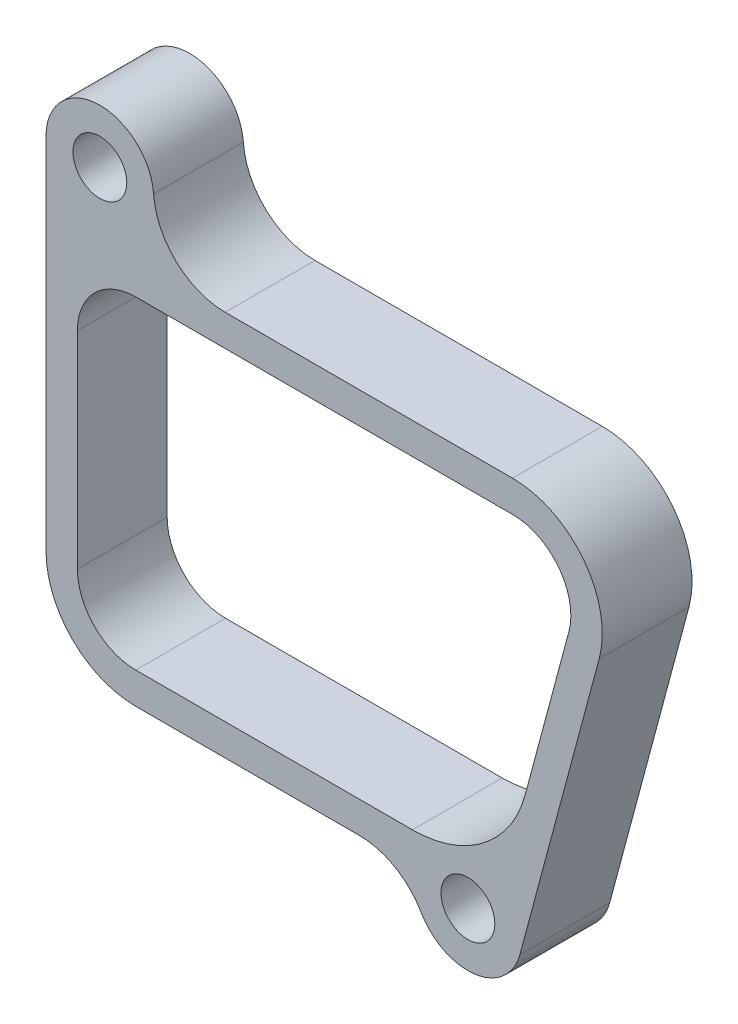
ISO-10303-21;
HEADER;
FILE_DESCRIPTION(('STEP AP214'),'2;1');
FILE_NAME('part.step','',(''),(''),'','','');
FILE_SCHEMA(('AUTOMOTIVE_DESIGN { 1 0 10303 214 1 1 1 1 }'));
ENDSEC;
DATA;
#1=APPLICATION_CONTEXT('core data for automotive mechanical design processes');
#2=APPLICATION_PROTOCOL_DEFINITION('international standard','automotive_design',2000,#1);
#3=PRODUCT_CONTEXT('',#1,'mechanical');
#4=PRODUCT('Part','Part','',(#3));
#5=PRODUCT_RELATED_PRODUCT_CATEGORY('part','',(#4));
#6=PRODUCT_DEFINITION_FORMATION('','',#4);
#7=PRODUCT_DEFINITION_CONTEXT('part definition',#1,'design');
#8=PRODUCT_DEFINITION('design','',#6,#7);
#9=PRODUCT_DEFINITION_SHAPE('','',#8);
#10=(LENGTH_UNIT() NAMED_UNIT(*) SI_UNIT(.MILLI.,.METRE.));
#11=(NAMED_UNIT(*) PLANE_ANGLE_UNIT() SI_UNIT($,.RADIAN.));
#12=(NAMED_UNIT(*) SI_UNIT($,.STERADIAN.) SOLID_ANGLE_UNIT());
#13=UNCERTAINTY_MEASURE_WITH_UNIT(LENGTH_MEASURE(1.E-05),#10,'distance_accuracy_value','');
#14=(GEOMETRIC_REPRESENTATION_CONTEXT(3) GLOBAL_UNCERTAINTY_ASSIGNED_CONTEXT((#13)) GLOBAL_UNIT_ASSIGNED_CONTEXT((#10,
#11,#12)) REPRESENTATION_CONTEXT('',''));
#15=CARTESIAN_POINT('',(0.,0.,0.));
#16=DIRECTION('',(0.,0.,1.));
#17=DIRECTION('',(1.,0.,0.));
#18=AXIS2_PLACEMENT_3D('',#15,#16,#17);
#19=CARTESIAN_POINT('',(113.598151470631,-30.4385329482234,10.));
#20=DIRECTION('',(-0.965925826289069,0.258819045102518,0.));
#21=DIRECTION('',(-0.258819045102518,-0.965925826289069,0.));
#22=AXIS2_PLACEMENT_3D('',#19,#20,#21);
#23=PLANE('',#22);
#24=DIRECTION('',(0.258819045102518,0.965925826289069,0.));
#25=VECTOR('',#24,1.);
#26=CARTESIAN_POINT('',(113.598151470631,-30.4385329482234,-10.));
#27=LINE('',#26,#25);
#28=CARTESIAN_POINT('',(93.5911099154689,-105.10582854123,-10.));
#29=VERTEX_POINT('',#28);
#30=CARTESIAN_POINT('',(111.256852167817,-39.1763809020504,-10.));
#31=VERTEX_POINT('',#30);
#32=EDGE_CURVE('E247',#29,#31,#27,.T.);
#33=ORIENTED_EDGE('',*,*,#32,.T.);
#34=DIRECTION('',(0.,0.,-1.));
#35=VECTOR('',#34,1.);
#36=CARTESIAN_POINT('',(111.256852167817,-39.1763809020504,10.));
#37=LINE('',#36,#35);
#38=CARTESIAN_POINT('',(111.256852167817,-39.1763809020504,10.));
#39=VERTEX_POINT('',#38);
#40=EDGE_CURVE('E11',#39,#31,#37,.T.);
#41=ORIENTED_EDGE('',*,*,#40,.F.);
#42=DIRECTION('',(0.258819045102518,0.965925826289069,0.));
#43=VECTOR('',#42,1.);
#44=CARTESIAN_POINT('',(113.598151470631,-30.4385329482234,10.));
#45=LINE('',#44,#43);
#46=CARTESIAN_POINT('',(93.5911099154689,-105.10582854123,10.));
#47=VERTEX_POINT('',#46);
#48=EDGE_CURVE('E374',#47,#39,#45,.T.);
#49=ORIENTED_EDGE('',*,*,#48,.F.);
#50=DIRECTION('',(0.,0.,-1.));
#51=VECTOR('',#50,1.);
#52=CARTESIAN_POINT('',(93.5911099154689,-105.10582854123,10.));
#53=LINE('',#52,#51);
#54=EDGE_CURVE('E286',#47,#29,#53,.T.);
#55=ORIENTED_EDGE('',*,*,#54,.T.);
#56=EDGE_LOOP('',(#33,#41,#49,#55));
#57=FACE_BOUND('',#56,.T.);
#58=ADVANCED_FACE('F43',(#57),#23,.F.);
#59=CARTESIAN_POINT('',(91.9383356420355,-34.,10.));
#60=DIRECTION('',(0.,0.,-1.));
#61=DIRECTION('',(-1.,0.,0.));
#62=AXIS2_PLACEMENT_3D('',#59,#60,#61);
#63=CYLINDRICAL_SURFACE('',#62,20.);
#64=CARTESIAN_POINT('',(91.9383356420355,-34.,-10.));
#65=DIRECTION('',(0.,0.,1.));
#66=DIRECTION('',(1.,0.,0.));
#67=AXIS2_PLACEMENT_3D('',#64,#65,#66);
#68=CIRCLE('',#67,20.);
#69=CARTESIAN_POINT('',(91.9383356420355,-14.,-10.));
#70=VERTEX_POINT('',#69);
#71=EDGE_CURVE('E251',#31,#70,#68,.T.);
#72=ORIENTED_EDGE('',*,*,#71,.T.);
#73=DIRECTION('',(0.,0.,-1.));
#74=VECTOR('',#73,1.);
#75=CARTESIAN_POINT('',(91.9383356420355,-14.,10.));
#76=LINE('',#75,#74);
#77=CARTESIAN_POINT('',(91.9383356420355,-14.,10.));
#78=VERTEX_POINT('',#77);
#79=EDGE_CURVE('E54',#78,#70,#76,.T.);
#80=ORIENTED_EDGE('',*,*,#79,.F.);
#81=CARTESIAN_POINT('',(91.9383356420355,-34.,10.));
#82=DIRECTION('',(0.,0.,1.));
#83=DIRECTION('',(1.,0.,0.));
#84=AXIS2_PLACEMENT_3D('',#81,#82,#83);
#85=CIRCLE('',#84,20.);
#86=EDGE_CURVE('E377',#39,#78,#85,.T.);
#87=ORIENTED_EDGE('',*,*,#86,.F.);
#88=ORIENTED_EDGE('',*,*,#40,.T.);
#89=EDGE_LOOP('',(#72,#80,#87,#88));
#90=FACE_BOUND('',#89,.T.);
#91=ADVANCED_FACE('F421',(#90),#63,.T.);
#92=CARTESIAN_POINT('',(0.,-14.,10.));
#93=DIRECTION('',(0.,1.,0.));
#94=DIRECTION('',(0.,0.,1.));
#95=AXIS2_PLACEMENT_3D('',#92,#93,#94);
#96=PLANE('',#95);
#97=DIRECTION('',(1.,0.,0.));
#98=VECTOR('',#97,1.);
#99=CARTESIAN_POINT('',(0.,-14.,-10.));
#100=LINE('',#99,#98);
#101=CARTESIAN_POINT('',(27.9284800875379,-14.,-10.));
#102=VERTEX_POINT('',#101);
#103=EDGE_CURVE('E255',#102,#70,#100,.T.);
#104=ORIENTED_EDGE('',*,*,#103,.F.);
#105=DIRECTION('',(0.,0.,-1.));
#106=VECTOR('',#105,1.);
#107=CARTESIAN_POINT('',(27.9284800875379,-14.,10.));
#108=LINE('',#107,#106);
#109=CARTESIAN_POINT('',(27.9284800875379,-14.,10.));
#110=VERTEX_POINT('',#109);
#111=EDGE_CURVE('E303',#110,#102,#108,.T.);
#112=ORIENTED_EDGE('',*,*,#111,.F.);
#113=DIRECTION('',(1.,0.,0.));
#114=VECTOR('',#113,1.);
#115=CARTESIAN_POINT('',(0.,-14.,10.));
#116=LINE('',#115,#114);
#117=EDGE_CURVE('E380',#110,#78,#116,.T.);
#118=ORIENTED_EDGE('',*,*,#117,.T.);
#119=ORIENTED_EDGE('',*,*,#79,.T.);
#120=EDGE_LOOP('',(#104,#112,#118,#119));
#121=FACE_BOUND('',#120,.T.);
#122=ADVANCED_FACE('F426',(#121),#96,.T.);
#123=CARTESIAN_POINT('',(27.9284800875379,1.99999999999999,10.));
#124=DIRECTION('',(0.,0.,-1.));
#125=DIRECTION('',(-1.,0.,0.));
#126=AXIS2_PLACEMENT_3D('',#123,#124,#125);
#127=CYLINDRICAL_SURFACE('',#126,16.);
#128=CARTESIAN_POINT('',(27.9284800875379,1.99999999999999,-10.));
#129=DIRECTION('',(0.,0.,1.));
#130=DIRECTION('',(1.,0.,0.));
#131=AXIS2_PLACEMENT_3D('',#128,#129,#130);
#132=CIRCLE('',#131,16.);
#133=CARTESIAN_POINT('',(11.9693486089448,0.857142857142852,-10.));
#134=VERTEX_POINT('',#133);
#135=EDGE_CURVE('E259',#134,#102,#132,.T.);
#136=ORIENTED_EDGE('',*,*,#135,.F.);
#137=DIRECTION('',(0.,0.,-1.));
#138=VECTOR('',#137,1.);
#139=CARTESIAN_POINT('',(11.9693486089448,0.857142857142852,10.));
#140=LINE('',#139,#138);
#141=CARTESIAN_POINT('',(11.9693486089448,0.857142857142852,10.));
#142=VERTEX_POINT('',#141);
#143=EDGE_CURVE('E300',#142,#134,#140,.T.);
#144=ORIENTED_EDGE('',*,*,#143,.F.);
#145=CARTESIAN_POINT('',(27.9284800875379,1.99999999999999,10.));
#146=DIRECTION('',(0.,0.,1.));
#147=DIRECTION('',(1.,0.,0.));
#148=AXIS2_PLACEMENT_3D('',#145,#146,#147);
#149=CIRCLE('',#148,16.);
#150=EDGE_CURVE('E384',#142,#110,#149,.T.);
#151=ORIENTED_EDGE('',*,*,#150,.T.);
#152=ORIENTED_EDGE('',*,*,#111,.T.);
#153=EDGE_LOOP('',(#136,#144,#151,#152));
#154=FACE_BOUND('',#153,.T.);
#155=ADVANCED_FACE('F461',(#154),#127,.F.);
#156=CARTESIAN_POINT('',(0.,0.,10.));
#157=DIRECTION('',(0.,0.,-1.));
#158=DIRECTION('',(-1.,0.,0.));
#159=AXIS2_PLACEMENT_3D('',#156,#157,#158);
#160=CYLINDRICAL_SURFACE('',#159,12.);
#161=CARTESIAN_POINT('',(0.,0.,-10.));
#162=DIRECTION('',(0.,0.,1.));
#163=DIRECTION('',(1.,0.,0.));
#164=AXIS2_PLACEMENT_3D('',#161,#162,#163);
#165=CIRCLE('',#164,12.);
#166=CARTESIAN_POINT('',(-12.,0.,-10.));
#167=VERTEX_POINT('',#166);
#168=EDGE_CURVE('E263',#134,#167,#165,.T.);
#169=ORIENTED_EDGE('',*,*,#168,.T.);
#170=DIRECTION('',(0.,0.,-1.));
#171=VECTOR('',#170,1.);
#172=CARTESIAN_POINT('',(-12.,0.,10.));
#173=LINE('',#172,#171);
#174=CARTESIAN_POINT('',(-12.,0.,10.));
#175=VERTEX_POINT('',#174);
#176=EDGE_CURVE('E296',#175,#167,#173,.T.);
#177=ORIENTED_EDGE('',*,*,#176,.F.);
#178=CARTESIAN_POINT('',(0.,0.,10.));
#179=DIRECTION('',(0.,0.,1.));
#180=DIRECTION('',(1.,0.,0.));
#181=AXIS2_PLACEMENT_3D('',#178,#179,#180);
#182=CIRCLE('',#181,12.);
#183=EDGE_CURVE('E388',#142,#175,#182,.T.);
#184=ORIENTED_EDGE('',*,*,#183,.F.);
#185=ORIENTED_EDGE('',*,*,#143,.T.);
#186=EDGE_LOOP('',(#169,#177,#184,#185));
#187=FACE_BOUND('',#186,.T.);
#188=ADVANCED_FACE('F457',(#187),#160,.T.);
#189=CARTESIAN_POINT('',(-12.,0.,10.));
#190=DIRECTION('',(1.,0.,0.));
#191=DIRECTION('',(0.,1.,0.));
#192=AXIS2_PLACEMENT_3D('',#189,#190,#191);
#193=PLANE('',#192);
#194=DIRECTION('',(0.,-1.,0.));
#195=VECTOR('',#194,1.);
#196=CARTESIAN_POINT('',(-12.,0.,-10.));
#197=LINE('',#196,#195);
#198=CARTESIAN_POINT('',(-12.,-79.9999999999999,-10.));
#199=VERTEX_POINT('',#198);
#200=EDGE_CURVE('E266',#167,#199,#197,.T.);
#201=ORIENTED_EDGE('',*,*,#200,.T.);
#202=DIRECTION('',(0.,0.,-1.));
#203=VECTOR('',#202,1.);
#204=CARTESIAN_POINT('',(-12.,-79.9999999999999,10.));
#205=LINE('',#204,#203);
#206=CARTESIAN_POINT('',(-12.,-79.9999999999999,10.));
#207=VERTEX_POINT('',#206);
#208=EDGE_CURVE('E293',#207,#199,#205,.T.);
#209=ORIENTED_EDGE('',*,*,#208,.F.);
#210=DIRECTION('',(0.,-1.,0.));
#211=VECTOR('',#210,1.);
#212=CARTESIAN_POINT('',(-12.,0.,10.));
#213=LINE('',#212,#211);
#214=EDGE_CURVE('E391',#175,#207,#213,.T.);
#215=ORIENTED_EDGE('',*,*,#214,.F.);
#216=ORIENTED_EDGE('',*,*,#176,.T.);
#217=EDGE_LOOP('',(#201,#209,#215,#216));
#218=FACE_BOUND('',#217,.T.);
#219=ADVANCED_FACE('F454',(#218),#193,.F.);
#220=CARTESIAN_POINT('',(8.00000000000001,-80.,10.));
#221=DIRECTION('',(0.,0.,-1.));
#222=DIRECTION('',(-1.,0.,0.));
#223=AXIS2_PLACEMENT_3D('',#220,#221,#222);
#224=CYLINDRICAL_SURFACE('',#223,20.);
#225=CARTESIAN_POINT('',(8.00000000000001,-80.,-10.));
#226=DIRECTION('',(0.,0.,1.));
#227=DIRECTION('',(1.,0.,0.));
#228=AXIS2_PLACEMENT_3D('',#225,#226,#227);
#229=CIRCLE('',#228,20.);
#230=CARTESIAN_POINT('',(8.00000000000015,-100.,-10.));
#231=VERTEX_POINT('',#230);
#232=EDGE_CURVE('E270',#231,#199,#229,.F.);
#233=ORIENTED_EDGE('',*,*,#232,.F.);
#234=DIRECTION('',(0.,0.,-1.));
#235=VECTOR('',#234,1.);
#236=CARTESIAN_POINT('',(8.00000000000015,-100.,10.));
#237=LINE('',#236,#235);
#238=CARTESIAN_POINT('',(8.00000000000015,-100.,10.));
#239=VERTEX_POINT('',#238);
#240=EDGE_CURVE('E197',#239,#231,#237,.T.);
#241=ORIENTED_EDGE('',*,*,#240,.F.);
#242=CARTESIAN_POINT('',(8.00000000000001,-80.,10.));
#243=DIRECTION('',(0.,0.,1.));
#244=DIRECTION('',(1.,0.,0.));
#245=AXIS2_PLACEMENT_3D('',#242,#243,#244);
#246=CIRCLE('',#245,20.);
#247=EDGE_CURVE('E184',#239,#207,#246,.F.);
#248=ORIENTED_EDGE('',*,*,#247,.T.);
#249=ORIENTED_EDGE('',*,*,#208,.T.);
#250=EDGE_LOOP('',(#233,#241,#248,#249));
#251=FACE_BOUND('',#250,.T.);
#252=ADVANCED_FACE('F396',(#251),#224,.T.);
#253=CARTESIAN_POINT('',(0.,-100.,10.));
#254=DIRECTION('',(0.,1.,0.));
#255=DIRECTION('',(-1.,0.,0.));
#256=AXIS2_PLACEMENT_3D('',#253,#254,#255);
#257=PLANE('',#256);
#258=DIRECTION('',(1.,0.,0.));
#259=VECTOR('',#258,1.);
#260=CARTESIAN_POINT('',(0.,-100.,-10.));
#261=LINE('',#260,#259);
#262=CARTESIAN_POINT('',(57.7512886940357,-100.,-10.));
#263=VERTEX_POINT('',#262);
#264=EDGE_CURVE('E192',#231,#263,#261,.T.);
#265=ORIENTED_EDGE('',*,*,#264,.T.);
#266=DIRECTION('',(0.,0.,-1.));
#267=VECTOR('',#266,1.);
#268=CARTESIAN_POINT('',(57.7512886940357,-100.,10.));
#269=LINE('',#268,#267);
#270=CARTESIAN_POINT('',(57.7512886940357,-100.,10.));
#271=VERTEX_POINT('',#270);
#272=EDGE_CURVE('E189',#271,#263,#269,.T.);
#273=ORIENTED_EDGE('',*,*,#272,.F.);
#274=DIRECTION('',(1.,0.,0.));
#275=VECTOR('',#274,1.);
#276=CARTESIAN_POINT('',(0.,-100.,10.));
#277=LINE('',#276,#275);
#278=EDGE_CURVE('E177',#239,#271,#277,.T.);
#279=ORIENTED_EDGE('',*,*,#278,.F.);
#280=ORIENTED_EDGE('',*,*,#240,.T.);
#281=EDGE_LOOP('',(#265,#273,#279,#280));
#282=FACE_BOUND('',#281,.T.);
#283=ADVANCED_FACE('F190',(#282),#257,.F.);
#284=CARTESIAN_POINT('',(57.7512886940357,-116.,10.));
#285=DIRECTION('',(0.,0.,-1.));
#286=DIRECTION('',(-1.,0.,0.));
#287=AXIS2_PLACEMENT_3D('',#284,#285,#286);
#288=CYLINDRICAL_SURFACE('',#287,16.);
#289=CARTESIAN_POINT('',(57.7512886940357,-116.,-10.));
#290=DIRECTION('',(0.,0.,1.));
#291=DIRECTION('',(1.,0.,0.));
#292=AXIS2_PLACEMENT_3D('',#289,#290,#291);
#293=CIRCLE('',#292,16.);
#294=CARTESIAN_POINT('',(71.6076951545868,-108.,-10.));
#295=VERTEX_POINT('',#294);
#296=EDGE_CURVE('E276',#295,#263,#293,.T.);
#297=ORIENTED_EDGE('',*,*,#296,.F.);
#298=DIRECTION('',(0.,0.,-1.));
#299=VECTOR('',#298,1.);
#300=CARTESIAN_POINT('',(71.6076951545868,-108.,10.));
#301=LINE('',#300,#299);
#302=CARTESIAN_POINT('',(71.6076951545868,-108.,10.));
#303=VERTEX_POINT('',#302);
#304=EDGE_CURVE('E121',#303,#295,#301,.T.);
#305=ORIENTED_EDGE('',*,*,#304,.F.);
#306=CARTESIAN_POINT('',(57.7512886940357,-116.,10.));
#307=DIRECTION('',(0.,0.,1.));
#308=DIRECTION('',(1.,0.,0.));
#309=AXIS2_PLACEMENT_3D('',#306,#307,#308);
#310=CIRCLE('',#309,16.);
#311=EDGE_CURVE('E182',#303,#271,#310,.T.);
#312=ORIENTED_EDGE('',*,*,#311,.T.);
#313=ORIENTED_EDGE('',*,*,#272,.T.);
#314=EDGE_LOOP('',(#297,#305,#312,#313));
#315=FACE_BOUND('',#314,.T.);
#316=ADVANCED_FACE('F199',(#315),#288,.F.);
#317=CARTESIAN_POINT('',(91.9383356420355,-34.,10.));
#318=DIRECTION('',(0.,0.,-1.));
#319=DIRECTION('',(-1.,0.,0.));
#320=AXIS2_PLACEMENT_3D('',#317,#318,#319);
#321=CYLINDRICAL_SURFACE('',#320,13.);
#322=CARTESIAN_POINT('',(91.9383356420355,-34.,-10.));
#323=DIRECTION('',(0.,0.,1.));
#324=DIRECTION('',(1.,0.,0.));
#325=AXIS2_PLACEMENT_3D('',#322,#323,#324);
#326=CIRCLE('',#325,13.);
#327=CARTESIAN_POINT('',(104.495371383793,-37.3646475863327,-10.));
#328=VERTEX_POINT('',#327);
#329=CARTESIAN_POINT('',(91.9383356420355,-21.,-10.));
#330=VERTEX_POINT('',#329);
#331=EDGE_CURVE('E215',#328,#330,#326,.T.);
#332=ORIENTED_EDGE('',*,*,#331,.F.);
#333=DIRECTION('',(0.,0.,-1.));
#334=VECTOR('',#333,1.);
#335=CARTESIAN_POINT('',(104.495371383793,-37.3646475863327,10.));
#336=LINE('',#335,#334);
#337=CARTESIAN_POINT('',(104.495371383793,-37.3646475863327,10.));
#338=VERTEX_POINT('',#337);
#339=EDGE_CURVE('E47',#338,#328,#336,.T.);
#340=ORIENTED_EDGE('',*,*,#339,.F.);
#341=CARTESIAN_POINT('',(91.9383356420355,-34.,10.));
#342=DIRECTION('',(0.,0.,1.));
#343=DIRECTION('',(1.,0.,0.));
#344=AXIS2_PLACEMENT_3D('',#341,#342,#343);
#345=CIRCLE('',#344,13.);
#346=CARTESIAN_POINT('',(91.9383356420355,-21.,10.));
#347=VERTEX_POINT('',#346);
#348=EDGE_CURVE('E666',#338,#347,#345,.T.);
#349=ORIENTED_EDGE('',*,*,#348,.T.);
#350=DIRECTION('',(0.,0.,-1.));
#351=VECTOR('',#350,1.);
#352=CARTESIAN_POINT('',(91.9383356420355,-21.,10.));
#353=LINE('',#352,#351);
#354=EDGE_CURVE('E210',#347,#330,#353,.T.);
#355=ORIENTED_EDGE('',*,*,#354,.T.);
#356=EDGE_LOOP('',(#332,#340,#349,#355));
#357=FACE_BOUND('',#356,.T.);
#358=ADVANCED_FACE('F337',(#357),#321,.F.);
#359=CARTESIAN_POINT('',(106.836670686607,-28.6267996325058,10.));
#360=DIRECTION('',(-0.965925826289069,0.258819045102517,0.));
#361=DIRECTION('',(-0.258819045102517,-0.965925826289069,0.));
#362=AXIS2_PLACEMENT_3D('',#359,#360,#361);
#363=PLANE('',#362);
#364=DIRECTION('',(0.258819045102517,0.965925826289069,0.));
#365=VECTOR('',#364,1.);
#366=CARTESIAN_POINT('',(106.836670686607,-28.6267996325058,-10.));
#367=LINE('',#366,#365);
#368=CARTESIAN_POINT('',(94.7514934299933,-73.7292951726655,-10.));
#369=VERTEX_POINT('',#368);
#370=EDGE_CURVE('E219',#369,#328,#367,.T.);
#371=ORIENTED_EDGE('',*,*,#370,.F.);
#372=DIRECTION('',(0.,0.,-1.));
#373=VECTOR('',#372,1.);
#374=CARTESIAN_POINT('',(94.7514934299933,-73.7292951726655,10.));
#375=LINE('',#374,#373);
#376=CARTESIAN_POINT('',(94.7514934299933,-73.7292951726655,10.));
#377=VERTEX_POINT('',#376);
#378=EDGE_CURVE('E325',#377,#369,#375,.T.);
#379=ORIENTED_EDGE('',*,*,#378,.F.);
#380=DIRECTION('',(0.258819045102517,0.965925826289069,0.));
#381=VECTOR('',#380,1.);
#382=CARTESIAN_POINT('',(106.836670686607,-28.6267996325058,10.));
#383=LINE('',#382,#381);
#384=EDGE_CURVE('E336',#377,#338,#383,.T.);
#385=ORIENTED_EDGE('',*,*,#384,.T.);
#386=ORIENTED_EDGE('',*,*,#339,.T.);
#387=EDGE_LOOP('',(#371,#379,#385,#386));
#388=FACE_BOUND('',#387,.T.);
#389=ADVANCED_FACE('F334',(#388),#363,.T.);
#390=CARTESIAN_POINT('',(69.6374219464775,-67.,10.));
#391=DIRECTION('',(0.,0.,-1.));
#392=DIRECTION('',(-1.,0.,0.));
#393=AXIS2_PLACEMENT_3D('',#390,#391,#392);
#394=CYLINDRICAL_SURFACE('',#393,26.);
#395=CARTESIAN_POINT('',(69.6374219464775,-67.,-10.));
#396=DIRECTION('',(0.,0.,1.));
#397=DIRECTION('',(1.,0.,0.));
#398=AXIS2_PLACEMENT_3D('',#395,#396,#397);
#399=CIRCLE('',#398,26.);
#400=CARTESIAN_POINT('',(69.6374219464775,-93.,-10.));
#401=VERTEX_POINT('',#400);
#402=EDGE_CURVE('E223',#401,#369,#399,.T.);
#403=ORIENTED_EDGE('',*,*,#402,.F.);
#404=DIRECTION('',(0.,0.,-1.));
#405=VECTOR('',#404,1.);
#406=CARTESIAN_POINT('',(69.6374219464775,-93.,10.));
#407=LINE('',#406,#405);
#408=CARTESIAN_POINT('',(69.6374219464775,-93.,10.));
#409=VERTEX_POINT('',#408);
#410=EDGE_CURVE('E323',#409,#401,#407,.T.);
#411=ORIENTED_EDGE('',*,*,#410,.F.);
#412=CARTESIAN_POINT('',(69.6374219464775,-67.,10.));
#413=DIRECTION('',(0.,0.,1.));
#414=DIRECTION('',(1.,0.,0.));
#415=AXIS2_PLACEMENT_3D('',#412,#413,#414);
#416=CIRCLE('',#415,26.);
#417=EDGE_CURVE('E346',#409,#377,#416,.T.);
#418=ORIENTED_EDGE('',*,*,#417,.T.);
#419=ORIENTED_EDGE('',*,*,#378,.T.);
#420=EDGE_LOOP('',(#403,#411,#418,#419));
#421=FACE_BOUND('',#420,.T.);
#422=ADVANCED_FACE('F344',(#421),#394,.F.);
#423=CARTESIAN_POINT('',(0.,-93.,10.));
#424=DIRECTION('',(0.,1.,0.));
#425=DIRECTION('',(0.,0.,1.));
#426=AXIS2_PLACEMENT_3D('',#423,#424,#425);
#427=PLANE('',#426);
#428=DIRECTION('',(1.,0.,0.));
#429=VECTOR('',#428,1.);
#430=CARTESIAN_POINT('',(0.,-93.,-10.));
#431=LINE('',#430,#429);
#432=CARTESIAN_POINT('',(8.0000000000001,-93.,-10.));
#433=VERTEX_POINT('',#432);
#434=EDGE_CURVE('E227',#433,#401,#431,.T.);
#435=ORIENTED_EDGE('',*,*,#434,.F.);
#436=DIRECTION('',(0.,0.,-1.));
#437=VECTOR('',#436,1.);
#438=CARTESIAN_POINT('',(8.0000000000001,-93.,10.));
#439=LINE('',#438,#437);
#440=CARTESIAN_POINT('',(8.0000000000001,-93.,10.));
#441=VERTEX_POINT('',#440);
#442=EDGE_CURVE('E320',#441,#433,#439,.T.);
#443=ORIENTED_EDGE('',*,*,#442,.F.);
#444=DIRECTION('',(1.,0.,0.));
#445=VECTOR('',#444,1.);
#446=CARTESIAN_POINT('',(0.,-93.,10.));
#447=LINE('',#446,#445);
#448=EDGE_CURVE('E351',#441,#409,#447,.T.);
#449=ORIENTED_EDGE('',*,*,#448,.T.);
#450=ORIENTED_EDGE('',*,*,#410,.T.);
#451=EDGE_LOOP('',(#435,#443,#449,#450));
#452=FACE_BOUND('',#451,.T.);
#453=ADVANCED_FACE('F354',(#452),#427,.T.);
#454=CARTESIAN_POINT('',(8.00000000000001,-80.,10.));
#455=DIRECTION('',(0.,0.,-1.));
#456=DIRECTION('',(-1.,0.,0.));
#457=AXIS2_PLACEMENT_3D('',#454,#455,#456);
#458=CYLINDRICAL_SURFACE('',#457,13.);
#459=CARTESIAN_POINT('',(8.00000000000001,-80.,-10.));
#460=DIRECTION('',(0.,0.,1.));
#461=DIRECTION('',(1.,0.,0.));
#462=AXIS2_PLACEMENT_3D('',#459,#460,#461);
#463=CIRCLE('',#462,13.);
#464=CARTESIAN_POINT('',(-4.99999999999999,-79.9999999999999,-10.));
#465=VERTEX_POINT('',#464);
#466=EDGE_CURVE('E231',#433,#465,#463,.F.);
#467=ORIENTED_EDGE('',*,*,#466,.T.);
#468=DIRECTION('',(0.,0.,-1.));
#469=VECTOR('',#468,1.);
#470=CARTESIAN_POINT('',(-4.99999999999999,-79.9999999999999,10.));
#471=LINE('',#470,#469);
#472=CARTESIAN_POINT('',(-4.99999999999999,-79.9999999999999,10.));
#473=VERTEX_POINT('',#472);
#474=EDGE_CURVE('E317',#473,#465,#471,.T.);
#475=ORIENTED_EDGE('',*,*,#474,.F.);
#476=CARTESIAN_POINT('',(8.00000000000001,-80.,10.));
#477=DIRECTION('',(0.,0.,1.));
#478=DIRECTION('',(1.,0.,0.));
#479=AXIS2_PLACEMENT_3D('',#476,#477,#478);
#480=CIRCLE('',#479,13.);
#481=EDGE_CURVE('E357',#441,#473,#480,.F.);
#482=ORIENTED_EDGE('',*,*,#481,.F.);
#483=ORIENTED_EDGE('',*,*,#442,.T.);
#484=EDGE_LOOP('',(#467,#475,#482,#483));
#485=FACE_BOUND('',#484,.T.);
#486=ADVANCED_FACE('F433',(#485),#458,.F.);
#487=CARTESIAN_POINT('',(-5.,0.,10.));
#488=DIRECTION('',(1.,0.,0.));
#489=DIRECTION('',(0.,1.,0.));
#490=AXIS2_PLACEMENT_3D('',#487,#488,#489);
#491=PLANE('',#490);
#492=DIRECTION('',(0.,-1.,0.));
#493=VECTOR('',#492,1.);
#494=CARTESIAN_POINT('',(-5.,0.,-10.));
#495=LINE('',#494,#493);
#496=CARTESIAN_POINT('',(-5.,-34.,-10.));
#497=VERTEX_POINT('',#496);
#498=EDGE_CURVE('E235',#497,#465,#495,.T.);
#499=ORIENTED_EDGE('',*,*,#498,.F.);
#500=DIRECTION('',(0.,0.,-1.));
#501=VECTOR('',#500,1.);
#502=CARTESIAN_POINT('',(-5.,-34.,10.));
#503=LINE('',#502,#501);
#504=CARTESIAN_POINT('',(-5.,-34.,10.));
#505=VERTEX_POINT('',#504);
#506=EDGE_CURVE('E314',#505,#497,#503,.T.);
#507=ORIENTED_EDGE('',*,*,#506,.F.);
#508=DIRECTION('',(0.,-1.,0.));
#509=VECTOR('',#508,1.);
#510=CARTESIAN_POINT('',(-5.,0.,10.));
#511=LINE('',#510,#509);
#512=EDGE_CURVE('E360',#505,#473,#511,.T.);
#513=ORIENTED_EDGE('',*,*,#512,.T.);
#514=ORIENTED_EDGE('',*,*,#474,.T.);
#515=EDGE_LOOP('',(#499,#507,#513,#514));
#516=FACE_BOUND('',#515,.T.);
#517=ADVANCED_FACE('F415',(#516),#491,.T.);
#518=CARTESIAN_POINT('',(8.,-34.,10.));
#519=DIRECTION('',(0.,0.,-1.));
#520=DIRECTION('',(-1.,0.,0.));
#521=AXIS2_PLACEMENT_3D('',#518,#519,#520);
#522=CYLINDRICAL_SURFACE('',#521,13.);
#523=CARTESIAN_POINT('',(8.,-34.,-10.));
#524=DIRECTION('',(0.,0.,1.));
#525=DIRECTION('',(1.,0.,0.));
#526=AXIS2_PLACEMENT_3D('',#523,#524,#525);
#527=CIRCLE('',#526,13.);
#528=CARTESIAN_POINT('',(8.,-21.,-10.));
#529=VERTEX_POINT('',#528);
#530=EDGE_CURVE('E239',#497,#529,#527,.F.);
#531=ORIENTED_EDGE('',*,*,#530,.T.);
#532=DIRECTION('',(0.,0.,-1.));
#533=VECTOR('',#532,1.);
#534=CARTESIAN_POINT('',(8.,-21.,10.));
#535=LINE('',#534,#533);
#536=CARTESIAN_POINT('',(8.,-21.,10.));
#537=VERTEX_POINT('',#536);
#538=EDGE_CURVE('E310',#537,#529,#535,.T.);
#539=ORIENTED_EDGE('',*,*,#538,.F.);
#540=CARTESIAN_POINT('',(8.,-34.,10.));
#541=DIRECTION('',(0.,0.,1.));
#542=DIRECTION('',(1.,0.,0.));
#543=AXIS2_PLACEMENT_3D('',#540,#541,#542);
#544=CIRCLE('',#543,13.);
#545=EDGE_CURVE('E367',#505,#537,#544,.F.);
#546=ORIENTED_EDGE('',*,*,#545,.F.);
#547=ORIENTED_EDGE('',*,*,#506,.T.);
#548=EDGE_LOOP('',(#531,#539,#546,#547));
#549=FACE_BOUND('',#548,.T.);
#550=ADVANCED_FACE('F407',(#549),#522,.F.);
#551=CARTESIAN_POINT('',(82.,-102.,10.));
#552=DIRECTION('',(0.,0.,-1.));
#553=DIRECTION('',(-1.,0.,0.));
#554=AXIS2_PLACEMENT_3D('',#551,#552,#553);
#555=CYLINDRICAL_SURFACE('',#554,12.);
#556=CARTESIAN_POINT('',(82.,-102.,-10.));
#557=DIRECTION('',(0.,0.,1.));
#558=DIRECTION('',(1.,0.,0.));
#559=AXIS2_PLACEMENT_3D('',#556,#557,#558);
#560=CIRCLE('',#559,12.);
#561=EDGE_CURVE('E124',#295,#29,#560,.T.);
#562=ORIENTED_EDGE('',*,*,#561,.T.);
#563=ORIENTED_EDGE('',*,*,#54,.F.);
#564=CARTESIAN_POINT('',(82.,-102.,10.));
#565=DIRECTION('',(0.,0.,1.));
#566=DIRECTION('',(1.,0.,0.));
#567=AXIS2_PLACEMENT_3D('',#564,#565,#566);
#568=CIRCLE('',#567,12.);
#569=EDGE_CURVE('E63',#303,#47,#568,.T.);
#570=ORIENTED_EDGE('',*,*,#569,.F.);
#571=ORIENTED_EDGE('',*,*,#304,.T.);
#572=EDGE_LOOP('',(#562,#563,#570,#571));
#573=FACE_BOUND('',#572,.T.);
#574=ADVANCED_FACE('F404',(#573),#555,.T.);
#575=CARTESIAN_POINT('',(0.,-21.,10.));
#576=DIRECTION('',(0.,1.,0.));
#577=DIRECTION('',(-1.,0.,0.));
#578=AXIS2_PLACEMENT_3D('',#575,#576,#577);
#579=PLANE('',#578);
#580=DIRECTION('',(1.,0.,0.));
#581=VECTOR('',#580,1.);
#582=CARTESIAN_POINT('',(0.,-21.,-10.));
#583=LINE('',#582,#581);
#584=EDGE_CURVE('E243',#529,#330,#583,.T.);
#585=ORIENTED_EDGE('',*,*,#584,.T.);
#586=ORIENTED_EDGE('',*,*,#354,.F.);
#587=DIRECTION('',(1.,0.,0.));
#588=VECTOR('',#587,1.);
#589=CARTESIAN_POINT('',(0.,-21.,10.));
#590=LINE('',#589,#588);
#591=EDGE_CURVE('E371',#537,#347,#590,.T.);
#592=ORIENTED_EDGE('',*,*,#591,.F.);
#593=ORIENTED_EDGE('',*,*,#538,.T.);
#594=EDGE_LOOP('',(#585,#586,#592,#593));
#595=FACE_BOUND('',#594,.T.);
#596=ADVANCED_FACE('F406',(#595),#579,.F.);
#597=CARTESIAN_POINT('',(82.,-102.,10.));
#598=DIRECTION('',(0.,0.,-1.));
#599=DIRECTION('',(-1.,0.,0.));
#600=AXIS2_PLACEMENT_3D('',#597,#598,#599);
#601=CYLINDRICAL_SURFACE('',#600,6.);
#602=CARTESIAN_POINT('',(82.,-102.,10.));
#603=DIRECTION('',(0.,0.,1.));
#604=DIRECTION('',(1.,0.,0.));
#605=AXIS2_PLACEMENT_3D('',#602,#603,#604);
#606=CIRCLE('',#605,6.);
#607=CARTESIAN_POINT('',(88.,-102.,10.));
#608=VERTEX_POINT('',#607);
#609=EDGE_CURVE('E285',#608,#608,#606,.T.);
#610=ORIENTED_EDGE('',*,*,#609,.T.);
#611=EDGE_LOOP('',(#610));
#612=FACE_BOUND('',#611,.T.);
#613=CARTESIAN_POINT('',(82.,-102.,-10.));
#614=DIRECTION('',(0.,0.,1.));
#615=DIRECTION('',(1.,0.,0.));
#616=AXIS2_PLACEMENT_3D('',#613,#614,#615);
#617=CIRCLE('',#616,6.);
#618=CARTESIAN_POINT('',(88.,-102.,-10.));
#619=VERTEX_POINT('',#618);
#620=EDGE_CURVE('E211',#619,#619,#617,.T.);
#621=ORIENTED_EDGE('',*,*,#620,.F.);
#622=EDGE_LOOP('',(#621));
#623=FACE_BOUND('',#622,.T.);
#624=ADVANCED_FACE('F45',(#612,#623),#601,.F.);
#625=CARTESIAN_POINT('',(0.,0.,10.));
#626=DIRECTION('',(0.,0.,-1.));
#627=DIRECTION('',(-1.,0.,0.));
#628=AXIS2_PLACEMENT_3D('',#625,#626,#627);
#629=CYLINDRICAL_SURFACE('',#628,6.);
#630=CARTESIAN_POINT('',(0.,0.,10.));
#631=DIRECTION('',(0.,0.,1.));
#632=DIRECTION('',(1.,0.,0.));
#633=AXIS2_PLACEMENT_3D('',#630,#631,#632);
#634=CIRCLE('',#633,6.);
#635=CARTESIAN_POINT('',(6.,0.,10.));
#636=VERTEX_POINT('',#635);
#637=EDGE_CURVE('E203',#636,#636,#634,.T.);
#638=ORIENTED_EDGE('',*,*,#637,.T.);
#639=EDGE_LOOP('',(#638));
#640=FACE_BOUND('',#639,.T.);
#641=CARTESIAN_POINT('',(0.,0.,-10.));
#642=DIRECTION('',(0.,0.,1.));
#643=DIRECTION('',(1.,0.,0.));
#644=AXIS2_PLACEMENT_3D('',#641,#642,#643);
#645=CIRCLE('',#644,6.);
#646=CARTESIAN_POINT('',(6.,0.,-10.));
#647=VERTEX_POINT('',#646);
#648=EDGE_CURVE('E281',#647,#647,#645,.T.);
#649=ORIENTED_EDGE('',*,*,#648,.F.);
#650=EDGE_LOOP('',(#649));
#651=FACE_BOUND('',#650,.T.);
#652=ADVANCED_FACE('F574',(#640,#651),#629,.F.);
#653=CARTESIAN_POINT('',(0.,0.,10.));
#654=DIRECTION('',(0.,0.,1.));
#655=DIRECTION('',(1.,0.,0.));
#656=AXIS2_PLACEMENT_3D('',#653,#654,#655);
#657=PLANE('',#656);
#658=ORIENTED_EDGE('',*,*,#609,.F.);
#659=EDGE_LOOP('',(#658));
#660=FACE_BOUND('',#659,.T.);
#661=ORIENTED_EDGE('',*,*,#348,.F.);
#662=ORIENTED_EDGE('',*,*,#384,.F.);
#663=ORIENTED_EDGE('',*,*,#417,.F.);
#664=ORIENTED_EDGE('',*,*,#448,.F.);
#665=ORIENTED_EDGE('',*,*,#481,.T.);
#666=ORIENTED_EDGE('',*,*,#512,.F.);
#667=ORIENTED_EDGE('',*,*,#545,.T.);
#668=ORIENTED_EDGE('',*,*,#591,.T.);
#669=EDGE_LOOP('',(#661,#662,#663,#664,#665,#666,#667,#668));
#670=FACE_BOUND('',#669,.T.);
#671=ORIENTED_EDGE('',*,*,#48,.T.);
#672=ORIENTED_EDGE('',*,*,#86,.T.);
#673=ORIENTED_EDGE('',*,*,#117,.F.);
#674=ORIENTED_EDGE('',*,*,#150,.F.);
#675=ORIENTED_EDGE('',*,*,#183,.T.);
#676=ORIENTED_EDGE('',*,*,#214,.T.);
#677=ORIENTED_EDGE('',*,*,#247,.F.);
#678=ORIENTED_EDGE('',*,*,#278,.T.);
#679=ORIENTED_EDGE('',*,*,#311,.F.);
#680=ORIENTED_EDGE('',*,*,#569,.T.);
#681=EDGE_LOOP('',(#671,#672,#673,#674,#675,#676,#677,#678,#679,#680));
#682=FACE_BOUND('',#681,.T.);
#683=ORIENTED_EDGE('',*,*,#637,.F.);
#684=EDGE_LOOP('',(#683));
#685=FACE_BOUND('',#684,.T.);
#686=ADVANCED_FACE('F179',(#660,#670,#682,#685),#657,.T.);
#687=CARTESIAN_POINT('',(0.,0.,-10.));
#688=DIRECTION('',(0.,0.,1.));
#689=DIRECTION('',(1.,0.,0.));
#690=AXIS2_PLACEMENT_3D('',#687,#688,#689);
#691=PLANE('',#690);
#692=ORIENTED_EDGE('',*,*,#620,.T.);
#693=EDGE_LOOP('',(#692));
#694=FACE_BOUND('',#693,.T.);
#695=ORIENTED_EDGE('',*,*,#331,.T.);
#696=ORIENTED_EDGE('',*,*,#584,.F.);
#697=ORIENTED_EDGE('',*,*,#530,.F.);
#698=ORIENTED_EDGE('',*,*,#498,.T.);
#699=ORIENTED_EDGE('',*,*,#466,.F.);
#700=ORIENTED_EDGE('',*,*,#434,.T.);
#701=ORIENTED_EDGE('',*,*,#402,.T.);
#702=ORIENTED_EDGE('',*,*,#370,.T.);
#703=EDGE_LOOP('',(#695,#696,#697,#698,#699,#700,#701,#702));
#704=FACE_BOUND('',#703,.T.);
#705=ORIENTED_EDGE('',*,*,#32,.F.);
#706=ORIENTED_EDGE('',*,*,#561,.F.);
#707=ORIENTED_EDGE('',*,*,#296,.T.);
#708=ORIENTED_EDGE('',*,*,#264,.F.);
#709=ORIENTED_EDGE('',*,*,#232,.T.);
#710=ORIENTED_EDGE('',*,*,#200,.F.);
#711=ORIENTED_EDGE('',*,*,#168,.F.);
#712=ORIENTED_EDGE('',*,*,#135,.T.);
#713=ORIENTED_EDGE('',*,*,#103,.T.);
#714=ORIENTED_EDGE('',*,*,#71,.F.);
#715=EDGE_LOOP('',(#705,#706,#707,#708,#709,#710,#711,#712,#713,#714));
#716=FACE_BOUND('',#715,.T.);
#717=ORIENTED_EDGE('',*,*,#648,.T.);
#718=EDGE_LOOP('',(#717));
#719=FACE_BOUND('',#718,.T.);
#720=ADVANCED_FACE('F340',(#694,#704,#716,#719),#691,.F.);
#721=CLOSED_SHELL('',(#58,#91,#122,#155,#188,#219,#252,#283,#316,#358,#389,#422,#453,#486,#517,
#550,#574,#596,#624,#652,#686,#720));
#722=MANIFOLD_SOLID_BREP('B2',#721);
#723=ADVANCED_BREP_SHAPE_REPRESENTATION('',(#18,#722),#14);
#724=SHAPE_DEFINITION_REPRESENTATION(#9,#723);
ENDSEC;
END-ISO-10303-21;
